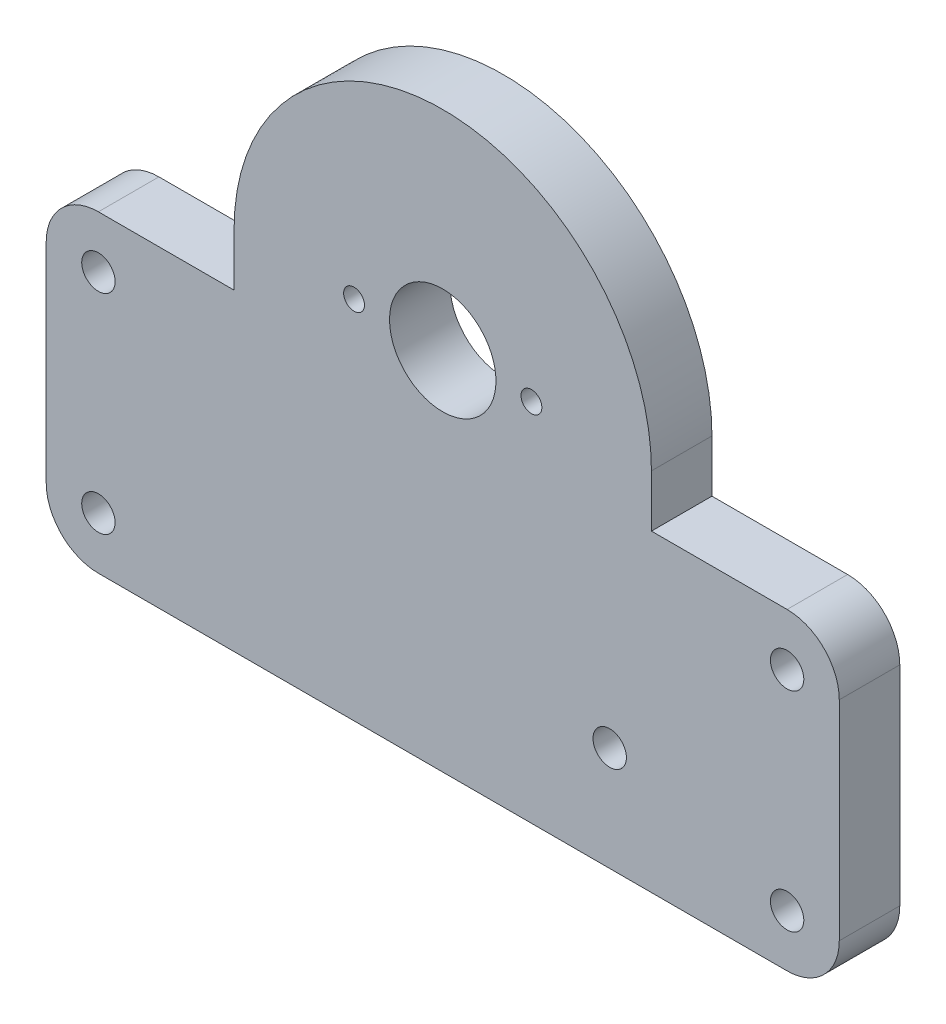
ISO-10303-21;
HEADER;
FILE_DESCRIPTION(('STEP AP214'),'2;1');
FILE_NAME('part.step','',(''),(''),'','','');
FILE_SCHEMA(('AUTOMOTIVE_DESIGN { 1 0 10303 214 1 1 1 1 }'));
ENDSEC;
DATA;
#1=APPLICATION_CONTEXT('core data for automotive mechanical design processes');
#2=APPLICATION_PROTOCOL_DEFINITION('international standard','automotive_design',2000,#1);
#3=PRODUCT_CONTEXT('',#1,'mechanical');
#4=PRODUCT('Part','Part','',(#3));
#5=PRODUCT_RELATED_PRODUCT_CATEGORY('part','',(#4));
#6=PRODUCT_DEFINITION_FORMATION('','',#4);
#7=PRODUCT_DEFINITION_CONTEXT('part definition',#1,'design');
#8=PRODUCT_DEFINITION('design','',#6,#7);
#9=PRODUCT_DEFINITION_SHAPE('','',#8);
#10=(LENGTH_UNIT() NAMED_UNIT(*) SI_UNIT(.MILLI.,.METRE.));
#11=(NAMED_UNIT(*) PLANE_ANGLE_UNIT() SI_UNIT($,.RADIAN.));
#12=(NAMED_UNIT(*) SI_UNIT($,.STERADIAN.) SOLID_ANGLE_UNIT());
#13=UNCERTAINTY_MEASURE_WITH_UNIT(LENGTH_MEASURE(1.E-05),#10,'distance_accuracy_value','');
#14=(GEOMETRIC_REPRESENTATION_CONTEXT(3) GLOBAL_UNCERTAINTY_ASSIGNED_CONTEXT((#13)) GLOBAL_UNIT_ASSIGNED_CONTEXT((#10,
#11,#12)) REPRESENTATION_CONTEXT('',''));
#15=CARTESIAN_POINT('',(0.,0.,0.));
#16=DIRECTION('',(0.,0.,1.));
#17=DIRECTION('',(1.,0.,0.));
#18=AXIS2_PLACEMENT_3D('',#15,#16,#17);
#19=CARTESIAN_POINT('',(38.,-30.,5.8));
#20=DIRECTION('',(-1.,0.,0.));
#21=DIRECTION('',(0.,0.,1.));
#22=AXIS2_PLACEMENT_3D('',#19,#20,#21);
#23=PLANE('',#22);
#24=DIRECTION('',(0.,1.,0.));
#25=VECTOR('',#24,1.);
#26=CARTESIAN_POINT('',(38.,-30.,0.));
#27=LINE('',#26,#25);
#28=CARTESIAN_POINT('',(38.,-25.,0.));
#29=VERTEX_POINT('',#28);
#30=CARTESIAN_POINT('',(38.,-5.,0.));
#31=VERTEX_POINT('',#30);
#32=EDGE_CURVE('E202',#29,#31,#27,.T.);
#33=ORIENTED_EDGE('',*,*,#32,.T.);
#34=DIRECTION('',(0.,0.,-1.));
#35=VECTOR('',#34,1.);
#36=CARTESIAN_POINT('',(38.,-5.,5.8));
#37=LINE('',#36,#35);
#38=CARTESIAN_POINT('',(38.,-5.,5.8));
#39=VERTEX_POINT('',#38);
#40=EDGE_CURVE('E12',#31,#39,#37,.F.);
#41=ORIENTED_EDGE('',*,*,#40,.T.);
#42=DIRECTION('',(0.,1.,0.));
#43=VECTOR('',#42,1.);
#44=CARTESIAN_POINT('',(38.,-30.,5.8));
#45=LINE('',#44,#43);
#46=CARTESIAN_POINT('',(38.,-25.,5.8));
#47=VERTEX_POINT('',#46);
#48=EDGE_CURVE('E183',#47,#39,#45,.T.);
#49=ORIENTED_EDGE('',*,*,#48,.F.);
#50=DIRECTION('',(0.,0.,-1.));
#51=VECTOR('',#50,1.);
#52=CARTESIAN_POINT('',(38.,-25.,5.8));
#53=LINE('',#52,#51);
#54=EDGE_CURVE('E225',#47,#29,#53,.T.);
#55=ORIENTED_EDGE('',*,*,#54,.T.);
#56=EDGE_LOOP('',(#33,#41,#49,#55));
#57=FACE_BOUND('',#56,.T.);
#58=ADVANCED_FACE('F37',(#57),#23,.F.);
#59=CARTESIAN_POINT('',(-38.,-30.,5.8));
#60=DIRECTION('',(1.,0.,0.));
#61=DIRECTION('',(0.,0.,-1.));
#62=AXIS2_PLACEMENT_3D('',#59,#60,#61);
#63=PLANE('',#62);
#64=DIRECTION('',(0.,-1.,0.));
#65=VECTOR('',#64,1.);
#66=CARTESIAN_POINT('',(-38.,-30.,5.8));
#67=LINE('',#66,#65);
#68=CARTESIAN_POINT('',(-38.,-5.,5.8));
#69=VERTEX_POINT('',#68);
#70=CARTESIAN_POINT('',(-38.,-25.,5.8));
#71=VERTEX_POINT('',#70);
#72=EDGE_CURVE('E187',#69,#71,#67,.T.);
#73=ORIENTED_EDGE('',*,*,#72,.F.);
#74=DIRECTION('',(0.,0.,-1.));
#75=VECTOR('',#74,1.);
#76=CARTESIAN_POINT('',(-38.,-5.,5.8));
#77=LINE('',#76,#75);
#78=CARTESIAN_POINT('',(-38.,-5.,0.));
#79=VERTEX_POINT('',#78);
#80=EDGE_CURVE('E228',#69,#79,#77,.T.);
#81=ORIENTED_EDGE('',*,*,#80,.T.);
#82=DIRECTION('',(0.,-1.,0.));
#83=VECTOR('',#82,1.);
#84=CARTESIAN_POINT('',(-38.,-30.,0.));
#85=LINE('',#84,#83);
#86=CARTESIAN_POINT('',(-38.,-25.,0.));
#87=VERTEX_POINT('',#86);
#88=EDGE_CURVE('E205',#79,#87,#85,.T.);
#89=ORIENTED_EDGE('',*,*,#88,.T.);
#90=DIRECTION('',(0.,0.,-1.));
#91=VECTOR('',#90,1.);
#92=CARTESIAN_POINT('',(-38.,-25.,5.8));
#93=LINE('',#92,#91);
#94=EDGE_CURVE('E201',#87,#71,#93,.F.);
#95=ORIENTED_EDGE('',*,*,#94,.T.);
#96=EDGE_LOOP('',(#73,#81,#89,#95));
#97=FACE_BOUND('',#96,.T.);
#98=ADVANCED_FACE('F249',(#97),#63,.F.);
#99=CARTESIAN_POINT('',(-38.,-30.,5.8));
#100=DIRECTION('',(0.,1.,0.));
#101=DIRECTION('',(0.,0.,1.));
#102=AXIS2_PLACEMENT_3D('',#99,#100,#101);
#103=PLANE('',#102);
#104=DIRECTION('',(1.,0.,0.));
#105=VECTOR('',#104,1.);
#106=CARTESIAN_POINT('',(-38.,-30.,5.8));
#107=LINE('',#106,#105);
#108=CARTESIAN_POINT('',(-33.,-30.,5.8));
#109=VERTEX_POINT('',#108);
#110=CARTESIAN_POINT('',(33.,-30.,5.8));
#111=VERTEX_POINT('',#110);
#112=EDGE_CURVE('E197',#109,#111,#107,.T.);
#113=ORIENTED_EDGE('',*,*,#112,.F.);
#114=DIRECTION('',(0.,0.,-1.));
#115=VECTOR('',#114,1.);
#116=CARTESIAN_POINT('',(-33.,-30.,5.8));
#117=LINE('',#116,#115);
#118=CARTESIAN_POINT('',(-33.,-30.,0.));
#119=VERTEX_POINT('',#118);
#120=EDGE_CURVE('E222',#109,#119,#117,.T.);
#121=ORIENTED_EDGE('',*,*,#120,.T.);
#122=DIRECTION('',(1.,0.,0.));
#123=VECTOR('',#122,1.);
#124=CARTESIAN_POINT('',(-38.,-30.,0.));
#125=LINE('',#124,#123);
#126=CARTESIAN_POINT('',(33.,-30.,0.));
#127=VERTEX_POINT('',#126);
#128=EDGE_CURVE('E188',#119,#127,#125,.T.);
#129=ORIENTED_EDGE('',*,*,#128,.T.);
#130=DIRECTION('',(0.,0.,-1.));
#131=VECTOR('',#130,1.);
#132=CARTESIAN_POINT('',(33.,-30.,5.8));
#133=LINE('',#132,#131);
#134=EDGE_CURVE('E220',#127,#111,#133,.F.);
#135=ORIENTED_EDGE('',*,*,#134,.T.);
#136=EDGE_LOOP('',(#113,#121,#129,#135));
#137=FACE_BOUND('',#136,.T.);
#138=ADVANCED_FACE('F360',(#137),#103,.F.);
#139=CARTESIAN_POINT('',(0.,0.,5.8));
#140=DIRECTION('',(0.,0.,-1.));
#141=DIRECTION('',(-1.,0.,0.));
#142=AXIS2_PLACEMENT_3D('',#139,#140,#141);
#143=PLANE('',#142);
#144=CARTESIAN_POINT('',(16.,-20.,5.8));
#145=DIRECTION('',(0.,0.,1.));
#146=DIRECTION('',(1.,0.,0.));
#147=AXIS2_PLACEMENT_3D('',#144,#145,#146);
#148=CIRCLE('',#147,1.6);
#149=CARTESIAN_POINT('',(17.6,-20.,5.8));
#150=VERTEX_POINT('',#149);
#151=EDGE_CURVE('E276',#150,#150,#148,.T.);
#152=ORIENTED_EDGE('',*,*,#151,.F.);
#153=EDGE_LOOP('',(#152));
#154=FACE_BOUND('',#153,.T.);
#155=CARTESIAN_POINT('',(8.5,5.,5.8));
#156=DIRECTION('',(0.,0.,-1.));
#157=DIRECTION('',(-1.,0.,0.));
#158=AXIS2_PLACEMENT_3D('',#155,#156,#157);
#159=CIRCLE('',#158,1.);
#160=CARTESIAN_POINT('',(7.5,5.,5.8));
#161=VERTEX_POINT('',#160);
#162=EDGE_CURVE('E135',#161,#161,#159,.T.);
#163=ORIENTED_EDGE('',*,*,#162,.T.);
#164=EDGE_LOOP('',(#163));
#165=FACE_BOUND('',#164,.T.);
#166=CARTESIAN_POINT('',(-8.5,5.,5.8));
#167=DIRECTION('',(0.,0.,-1.));
#168=DIRECTION('',(1.,0.,0.));
#169=AXIS2_PLACEMENT_3D('',#166,#167,#168);
#170=CIRCLE('',#169,1.);
#171=CARTESIAN_POINT('',(-7.5,5.,5.8));
#172=VERTEX_POINT('',#171);
#173=EDGE_CURVE('E290',#172,#172,#170,.T.);
#174=ORIENTED_EDGE('',*,*,#173,.T.);
#175=EDGE_LOOP('',(#174));
#176=FACE_BOUND('',#175,.T.);
#177=CARTESIAN_POINT('',(0.,5.,5.8));
#178=DIRECTION('',(0.,0.,-1.));
#179=DIRECTION('',(-1.,0.,0.));
#180=AXIS2_PLACEMENT_3D('',#177,#178,#179);
#181=CIRCLE('',#180,5.1);
#182=CARTESIAN_POINT('',(-5.1,5.,5.8));
#183=VERTEX_POINT('',#182);
#184=EDGE_CURVE('E189',#183,#183,#181,.T.);
#185=ORIENTED_EDGE('',*,*,#184,.T.);
#186=EDGE_LOOP('',(#185));
#187=FACE_BOUND('',#186,.T.);
#188=CARTESIAN_POINT('',(33.,-5.,5.8));
#189=DIRECTION('',(0.,0.,-1.));
#190=DIRECTION('',(-1.,0.,0.));
#191=AXIS2_PLACEMENT_3D('',#188,#189,#190);
#192=CIRCLE('',#191,1.6);
#193=CARTESIAN_POINT('',(31.4,-5.,5.8));
#194=VERTEX_POINT('',#193);
#195=EDGE_CURVE('E301',#194,#194,#192,.T.);
#196=ORIENTED_EDGE('',*,*,#195,.T.);
#197=EDGE_LOOP('',(#196));
#198=FACE_BOUND('',#197,.T.);
#199=CARTESIAN_POINT('',(33.,-25.,5.8));
#200=DIRECTION('',(0.,0.,-1.));
#201=DIRECTION('',(-1.,0.,0.));
#202=AXIS2_PLACEMENT_3D('',#199,#200,#201);
#203=CIRCLE('',#202,1.6);
#204=CARTESIAN_POINT('',(31.4,-25.,5.8));
#205=VERTEX_POINT('',#204);
#206=EDGE_CURVE('E304',#205,#205,#203,.T.);
#207=ORIENTED_EDGE('',*,*,#206,.T.);
#208=EDGE_LOOP('',(#207));
#209=FACE_BOUND('',#208,.T.);
#210=CARTESIAN_POINT('',(-33.,-25.,5.8));
#211=DIRECTION('',(0.,0.,-1.));
#212=DIRECTION('',(-1.,0.,0.));
#213=AXIS2_PLACEMENT_3D('',#210,#211,#212);
#214=CIRCLE('',#213,1.6);
#215=CARTESIAN_POINT('',(-34.6,-25.,5.8));
#216=VERTEX_POINT('',#215);
#217=EDGE_CURVE('E312',#216,#216,#214,.T.);
#218=ORIENTED_EDGE('',*,*,#217,.T.);
#219=EDGE_LOOP('',(#218));
#220=FACE_BOUND('',#219,.T.);
#221=CARTESIAN_POINT('',(-33.,-5.,5.8));
#222=DIRECTION('',(0.,0.,-1.));
#223=DIRECTION('',(-1.,0.,0.));
#224=AXIS2_PLACEMENT_3D('',#221,#222,#223);
#225=CIRCLE('',#224,1.6);
#226=CARTESIAN_POINT('',(-34.6,-5.,5.8));
#227=VERTEX_POINT('',#226);
#228=EDGE_CURVE('E315',#227,#227,#225,.T.);
#229=ORIENTED_EDGE('',*,*,#228,.T.);
#230=EDGE_LOOP('',(#229));
#231=FACE_BOUND('',#230,.T.);
#232=DIRECTION('',(-1.,0.,0.));
#233=VECTOR('',#232,1.);
#234=CARTESIAN_POINT('',(0.,0.,5.8));
#235=LINE('',#234,#233);
#236=CARTESIAN_POINT('',(-20.,0.,5.8));
#237=VERTEX_POINT('',#236);
#238=CARTESIAN_POINT('',(-33.,0.,5.8));
#239=VERTEX_POINT('',#238);
#240=EDGE_CURVE('E244',#237,#239,#235,.T.);
#241=ORIENTED_EDGE('',*,*,#240,.T.);
#242=CARTESIAN_POINT('',(-33.,-5.,5.8));
#243=DIRECTION('',(0.,0.,-1.));
#244=DIRECTION('',(-1.,0.,0.));
#245=AXIS2_PLACEMENT_3D('',#242,#243,#244);
#246=CIRCLE('',#245,5.);
#247=EDGE_CURVE('E238',#239,#69,#246,.F.);
#248=ORIENTED_EDGE('',*,*,#247,.T.);
#249=ORIENTED_EDGE('',*,*,#72,.T.);
#250=CARTESIAN_POINT('',(-33.,-25.,5.8));
#251=DIRECTION('',(0.,0.,-1.));
#252=DIRECTION('',(-1.,0.,0.));
#253=AXIS2_PLACEMENT_3D('',#250,#251,#252);
#254=CIRCLE('',#253,5.);
#255=EDGE_CURVE('E218',#71,#109,#254,.F.);
#256=ORIENTED_EDGE('',*,*,#255,.T.);
#257=ORIENTED_EDGE('',*,*,#112,.T.);
#258=CARTESIAN_POINT('',(33.,-25.,5.8));
#259=DIRECTION('',(0.,0.,-1.));
#260=DIRECTION('',(-1.,0.,0.));
#261=AXIS2_PLACEMENT_3D('',#258,#259,#260);
#262=CIRCLE('',#261,5.);
#263=EDGE_CURVE('E216',#111,#47,#262,.F.);
#264=ORIENTED_EDGE('',*,*,#263,.T.);
#265=ORIENTED_EDGE('',*,*,#48,.T.);
#266=CARTESIAN_POINT('',(33.,-5.,5.8));
#267=DIRECTION('',(0.,0.,-1.));
#268=DIRECTION('',(-1.,0.,0.));
#269=AXIS2_PLACEMENT_3D('',#266,#267,#268);
#270=CIRCLE('',#269,5.);
#271=CARTESIAN_POINT('',(33.,0.,5.8));
#272=VERTEX_POINT('',#271);
#273=EDGE_CURVE('E52',#39,#272,#270,.F.);
#274=ORIENTED_EDGE('',*,*,#273,.T.);
#275=DIRECTION('',(-1.,0.,0.));
#276=VECTOR('',#275,1.);
#277=CARTESIAN_POINT('',(0.,0.,5.8));
#278=LINE('',#277,#276);
#279=CARTESIAN_POINT('',(20.,0.,5.8));
#280=VERTEX_POINT('',#279);
#281=EDGE_CURVE('E165',#272,#280,#278,.T.);
#282=ORIENTED_EDGE('',*,*,#281,.T.);
#283=DIRECTION('',(0.,1.,0.));
#284=VECTOR('',#283,1.);
#285=CARTESIAN_POINT('',(20.,0.,5.8));
#286=LINE('',#285,#284);
#287=CARTESIAN_POINT('',(20.,5.,5.8));
#288=VERTEX_POINT('',#287);
#289=EDGE_CURVE('E144',#280,#288,#286,.T.);
#290=ORIENTED_EDGE('',*,*,#289,.T.);
#291=CARTESIAN_POINT('',(0.,5.,5.8));
#292=DIRECTION('',(0.,0.,-1.));
#293=DIRECTION('',(-1.,0.,0.));
#294=AXIS2_PLACEMENT_3D('',#291,#292,#293);
#295=CIRCLE('',#294,20.);
#296=CARTESIAN_POINT('',(-20.,5.,5.8));
#297=VERTEX_POINT('',#296);
#298=EDGE_CURVE('E264',#288,#297,#295,.F.);
#299=ORIENTED_EDGE('',*,*,#298,.T.);
#300=DIRECTION('',(0.,-1.,0.));
#301=VECTOR('',#300,1.);
#302=CARTESIAN_POINT('',(-20.,0.,5.8));
#303=LINE('',#302,#301);
#304=EDGE_CURVE('E260',#297,#237,#303,.T.);
#305=ORIENTED_EDGE('',*,*,#304,.T.);
#306=EDGE_LOOP('',(#241,#248,#249,#256,#257,#264,#265,#274,#282,#290,#299,#305));
#307=FACE_BOUND('',#306,.T.);
#308=ADVANCED_FACE('F242',(#154,#165,#176,#187,#198,#209,#220,#231,#307),#143,.F.);
#309=CARTESIAN_POINT('',(0.,0.,0.));
#310=DIRECTION('',(0.,0.,-1.));
#311=DIRECTION('',(-1.,0.,0.));
#312=AXIS2_PLACEMENT_3D('',#309,#310,#311);
#313=PLANE('',#312);
#314=CARTESIAN_POINT('',(16.,-20.,0.));
#315=DIRECTION('',(0.,0.,1.));
#316=DIRECTION('',(1.,0.,0.));
#317=AXIS2_PLACEMENT_3D('',#314,#315,#316);
#318=CIRCLE('',#317,1.6);
#319=CARTESIAN_POINT('',(17.6,-20.,0.));
#320=VERTEX_POINT('',#319);
#321=EDGE_CURVE('E280',#320,#320,#318,.T.);
#322=ORIENTED_EDGE('',*,*,#321,.T.);
#323=EDGE_LOOP('',(#322));
#324=FACE_BOUND('',#323,.T.);
#325=CARTESIAN_POINT('',(8.5,5.,0.));
#326=DIRECTION('',(0.,0.,-1.));
#327=DIRECTION('',(-1.,0.,0.));
#328=AXIS2_PLACEMENT_3D('',#325,#326,#327);
#329=CIRCLE('',#328,1.);
#330=CARTESIAN_POINT('',(7.5,5.,0.));
#331=VERTEX_POINT('',#330);
#332=EDGE_CURVE('E293',#331,#331,#329,.T.);
#333=ORIENTED_EDGE('',*,*,#332,.F.);
#334=EDGE_LOOP('',(#333));
#335=FACE_BOUND('',#334,.T.);
#336=CARTESIAN_POINT('',(-8.5,5.,0.));
#337=DIRECTION('',(0.,0.,-1.));
#338=DIRECTION('',(1.,0.,0.));
#339=AXIS2_PLACEMENT_3D('',#336,#337,#338);
#340=CIRCLE('',#339,1.);
#341=CARTESIAN_POINT('',(-7.5,5.,0.));
#342=VERTEX_POINT('',#341);
#343=EDGE_CURVE('E294',#342,#342,#340,.T.);
#344=ORIENTED_EDGE('',*,*,#343,.F.);
#345=EDGE_LOOP('',(#344));
#346=FACE_BOUND('',#345,.T.);
#347=ORIENTED_EDGE('',*,*,#88,.F.);
#348=CARTESIAN_POINT('',(-33.,-5.,0.));
#349=DIRECTION('',(0.,0.,-1.));
#350=DIRECTION('',(-1.,0.,0.));
#351=AXIS2_PLACEMENT_3D('',#348,#349,#350);
#352=CIRCLE('',#351,5.);
#353=CARTESIAN_POINT('',(-33.,0.,0.));
#354=VERTEX_POINT('',#353);
#355=EDGE_CURVE('E233',#79,#354,#352,.T.);
#356=ORIENTED_EDGE('',*,*,#355,.T.);
#357=DIRECTION('',(-1.,0.,0.));
#358=VECTOR('',#357,1.);
#359=CARTESIAN_POINT('',(-20.,0.,0.));
#360=LINE('',#359,#358);
#361=CARTESIAN_POINT('',(-20.,0.,0.));
#362=VERTEX_POINT('',#361);
#363=EDGE_CURVE('E146',#362,#354,#360,.T.);
#364=ORIENTED_EDGE('',*,*,#363,.F.);
#365=DIRECTION('',(0.,-1.,0.));
#366=VECTOR('',#365,1.);
#367=CARTESIAN_POINT('',(-20.,5.,0.));
#368=LINE('',#367,#366);
#369=CARTESIAN_POINT('',(-20.,5.,0.));
#370=VERTEX_POINT('',#369);
#371=EDGE_CURVE('E155',#370,#362,#368,.T.);
#372=ORIENTED_EDGE('',*,*,#371,.F.);
#373=CARTESIAN_POINT('',(0.,5.,0.));
#374=DIRECTION('',(0.,0.,1.));
#375=DIRECTION('',(1.,0.,0.));
#376=AXIS2_PLACEMENT_3D('',#373,#374,#375);
#377=CIRCLE('',#376,20.);
#378=CARTESIAN_POINT('',(20.,5.,0.));
#379=VERTEX_POINT('',#378);
#380=EDGE_CURVE('E153',#379,#370,#377,.T.);
#381=ORIENTED_EDGE('',*,*,#380,.F.);
#382=DIRECTION('',(0.,1.,0.));
#383=VECTOR('',#382,1.);
#384=CARTESIAN_POINT('',(20.,0.,0.));
#385=LINE('',#384,#383);
#386=CARTESIAN_POINT('',(20.,0.,0.));
#387=VERTEX_POINT('',#386);
#388=EDGE_CURVE('E134',#387,#379,#385,.T.);
#389=ORIENTED_EDGE('',*,*,#388,.F.);
#390=DIRECTION('',(-1.,0.,0.));
#391=VECTOR('',#390,1.);
#392=CARTESIAN_POINT('',(38.,0.,0.));
#393=LINE('',#392,#391);
#394=CARTESIAN_POINT('',(33.,0.,0.));
#395=VERTEX_POINT('',#394);
#396=EDGE_CURVE('E127',#395,#387,#393,.T.);
#397=ORIENTED_EDGE('',*,*,#396,.F.);
#398=CARTESIAN_POINT('',(33.,-5.,0.));
#399=DIRECTION('',(0.,0.,-1.));
#400=DIRECTION('',(-1.,0.,0.));
#401=AXIS2_PLACEMENT_3D('',#398,#399,#400);
#402=CIRCLE('',#401,5.);
#403=EDGE_CURVE('E231',#395,#31,#402,.T.);
#404=ORIENTED_EDGE('',*,*,#403,.T.);
#405=ORIENTED_EDGE('',*,*,#32,.F.);
#406=CARTESIAN_POINT('',(33.,-25.,0.));
#407=DIRECTION('',(0.,0.,-1.));
#408=DIRECTION('',(-1.,0.,0.));
#409=AXIS2_PLACEMENT_3D('',#406,#407,#408);
#410=CIRCLE('',#409,5.);
#411=EDGE_CURVE('E211',#29,#127,#410,.T.);
#412=ORIENTED_EDGE('',*,*,#411,.T.);
#413=ORIENTED_EDGE('',*,*,#128,.F.);
#414=CARTESIAN_POINT('',(-33.,-25.,0.));
#415=DIRECTION('',(0.,0.,-1.));
#416=DIRECTION('',(-1.,0.,0.));
#417=AXIS2_PLACEMENT_3D('',#414,#415,#416);
#418=CIRCLE('',#417,5.);
#419=EDGE_CURVE('E213',#119,#87,#418,.T.);
#420=ORIENTED_EDGE('',*,*,#419,.T.);
#421=EDGE_LOOP('',(#347,#356,#364,#372,#381,#389,#397,#404,#405,#412,#413,#420));
#422=FACE_BOUND('',#421,.T.);
#423=CARTESIAN_POINT('',(0.,5.,0.));
#424=DIRECTION('',(0.,0.,-1.));
#425=DIRECTION('',(-1.,0.,0.));
#426=AXIS2_PLACEMENT_3D('',#423,#424,#425);
#427=CIRCLE('',#426,5.1);
#428=CARTESIAN_POINT('',(-5.1,5.,0.));
#429=VERTEX_POINT('',#428);
#430=EDGE_CURVE('E322',#429,#429,#427,.T.);
#431=ORIENTED_EDGE('',*,*,#430,.F.);
#432=EDGE_LOOP('',(#431));
#433=FACE_BOUND('',#432,.T.);
#434=CARTESIAN_POINT('',(33.,-5.,0.));
#435=DIRECTION('',(0.,0.,-1.));
#436=DIRECTION('',(-1.,0.,0.));
#437=AXIS2_PLACEMENT_3D('',#434,#435,#436);
#438=CIRCLE('',#437,1.6);
#439=CARTESIAN_POINT('',(31.4,-5.,0.));
#440=VERTEX_POINT('',#439);
#441=EDGE_CURVE('E333',#440,#440,#438,.T.);
#442=ORIENTED_EDGE('',*,*,#441,.F.);
#443=EDGE_LOOP('',(#442));
#444=FACE_BOUND('',#443,.T.);
#445=CARTESIAN_POINT('',(33.,-25.,0.));
#446=DIRECTION('',(0.,0.,-1.));
#447=DIRECTION('',(-1.,0.,0.));
#448=AXIS2_PLACEMENT_3D('',#445,#446,#447);
#449=CIRCLE('',#448,1.6);
#450=CARTESIAN_POINT('',(31.4,-25.,0.));
#451=VERTEX_POINT('',#450);
#452=EDGE_CURVE('E330',#451,#451,#449,.T.);
#453=ORIENTED_EDGE('',*,*,#452,.F.);
#454=EDGE_LOOP('',(#453));
#455=FACE_BOUND('',#454,.T.);
#456=CARTESIAN_POINT('',(-33.,-25.,0.));
#457=DIRECTION('',(0.,0.,-1.));
#458=DIRECTION('',(1.,0.,0.));
#459=AXIS2_PLACEMENT_3D('',#456,#457,#458);
#460=CIRCLE('',#459,1.6);
#461=CARTESIAN_POINT('',(-31.4,-25.,0.));
#462=VERTEX_POINT('',#461);
#463=EDGE_CURVE('E327',#462,#462,#460,.T.);
#464=ORIENTED_EDGE('',*,*,#463,.F.);
#465=EDGE_LOOP('',(#464));
#466=FACE_BOUND('',#465,.T.);
#467=CARTESIAN_POINT('',(-33.,-5.,0.));
#468=DIRECTION('',(0.,0.,-1.));
#469=DIRECTION('',(1.,0.,0.));
#470=AXIS2_PLACEMENT_3D('',#467,#468,#469);
#471=CIRCLE('',#470,1.6);
#472=CARTESIAN_POINT('',(-31.4,-5.,0.));
#473=VERTEX_POINT('',#472);
#474=EDGE_CURVE('E323',#473,#473,#471,.T.);
#475=ORIENTED_EDGE('',*,*,#474,.F.);
#476=EDGE_LOOP('',(#475));
#477=FACE_BOUND('',#476,.T.);
#478=ADVANCED_FACE('F149',(#324,#335,#346,#422,#433,#444,#455,#466,#477),#313,.T.);
#479=CARTESIAN_POINT('',(-33.,-5.,50.));
#480=DIRECTION('',(0.,0.,-1.));
#481=DIRECTION('',(-1.,0.,0.));
#482=AXIS2_PLACEMENT_3D('',#479,#480,#481);
#483=CYLINDRICAL_SURFACE('',#482,1.6);
#484=ORIENTED_EDGE('',*,*,#474,.T.);
#485=EDGE_LOOP('',(#484));
#486=FACE_BOUND('',#485,.T.);
#487=ORIENTED_EDGE('',*,*,#228,.F.);
#488=EDGE_LOOP('',(#487));
#489=FACE_BOUND('',#488,.T.);
#490=ADVANCED_FACE('F342',(#486,#489),#483,.F.);
#491=CARTESIAN_POINT('',(-33.,-25.,50.));
#492=DIRECTION('',(0.,0.,-1.));
#493=DIRECTION('',(-1.,0.,0.));
#494=AXIS2_PLACEMENT_3D('',#491,#492,#493);
#495=CYLINDRICAL_SURFACE('',#494,1.6);
#496=ORIENTED_EDGE('',*,*,#463,.T.);
#497=EDGE_LOOP('',(#496));
#498=FACE_BOUND('',#497,.T.);
#499=ORIENTED_EDGE('',*,*,#217,.F.);
#500=EDGE_LOOP('',(#499));
#501=FACE_BOUND('',#500,.T.);
#502=ADVANCED_FACE('F355',(#498,#501),#495,.F.);
#503=CARTESIAN_POINT('',(33.,-25.,50.));
#504=DIRECTION('',(0.,0.,-1.));
#505=DIRECTION('',(-1.,0.,0.));
#506=AXIS2_PLACEMENT_3D('',#503,#504,#505);
#507=CYLINDRICAL_SURFACE('',#506,1.6);
#508=ORIENTED_EDGE('',*,*,#452,.T.);
#509=EDGE_LOOP('',(#508));
#510=FACE_BOUND('',#509,.T.);
#511=ORIENTED_EDGE('',*,*,#206,.F.);
#512=EDGE_LOOP('',(#511));
#513=FACE_BOUND('',#512,.T.);
#514=ADVANCED_FACE('F403',(#510,#513),#507,.F.);
#515=CARTESIAN_POINT('',(33.,-5.,50.));
#516=DIRECTION('',(0.,0.,-1.));
#517=DIRECTION('',(-1.,0.,0.));
#518=AXIS2_PLACEMENT_3D('',#515,#516,#517);
#519=CYLINDRICAL_SURFACE('',#518,1.6);
#520=ORIENTED_EDGE('',*,*,#441,.T.);
#521=EDGE_LOOP('',(#520));
#522=FACE_BOUND('',#521,.T.);
#523=ORIENTED_EDGE('',*,*,#195,.F.);
#524=EDGE_LOOP('',(#523));
#525=FACE_BOUND('',#524,.T.);
#526=ADVANCED_FACE('F400',(#522,#525),#519,.F.);
#527=CARTESIAN_POINT('',(0.,5.,50.));
#528=DIRECTION('',(0.,0.,-1.));
#529=DIRECTION('',(-1.,0.,0.));
#530=AXIS2_PLACEMENT_3D('',#527,#528,#529);
#531=CYLINDRICAL_SURFACE('',#530,5.1);
#532=ORIENTED_EDGE('',*,*,#430,.T.);
#533=EDGE_LOOP('',(#532));
#534=FACE_BOUND('',#533,.T.);
#535=ORIENTED_EDGE('',*,*,#184,.F.);
#536=EDGE_LOOP('',(#535));
#537=FACE_BOUND('',#536,.T.);
#538=ADVANCED_FACE('F338',(#534,#537),#531,.F.);
#539=CARTESIAN_POINT('',(-33.,-25.,5.8));
#540=DIRECTION('',(0.,0.,-1.));
#541=DIRECTION('',(-1.,0.,0.));
#542=AXIS2_PLACEMENT_3D('',#539,#540,#541);
#543=CYLINDRICAL_SURFACE('',#542,5.);
#544=ORIENTED_EDGE('',*,*,#255,.F.);
#545=ORIENTED_EDGE('',*,*,#94,.F.);
#546=ORIENTED_EDGE('',*,*,#419,.F.);
#547=ORIENTED_EDGE('',*,*,#120,.F.);
#548=EDGE_LOOP('',(#544,#545,#546,#547));
#549=FACE_BOUND('',#548,.T.);
#550=ADVANCED_FACE('F377',(#549),#543,.T.);
#551=CARTESIAN_POINT('',(33.,-25.,5.8));
#552=DIRECTION('',(0.,0.,-1.));
#553=DIRECTION('',(-1.,0.,0.));
#554=AXIS2_PLACEMENT_3D('',#551,#552,#553);
#555=CYLINDRICAL_SURFACE('',#554,5.);
#556=ORIENTED_EDGE('',*,*,#263,.F.);
#557=ORIENTED_EDGE('',*,*,#134,.F.);
#558=ORIENTED_EDGE('',*,*,#411,.F.);
#559=ORIENTED_EDGE('',*,*,#54,.F.);
#560=EDGE_LOOP('',(#556,#557,#558,#559));
#561=FACE_BOUND('',#560,.T.);
#562=ADVANCED_FACE('F380',(#561),#555,.T.);
#563=CARTESIAN_POINT('',(-20.,0.,13.5));
#564=DIRECTION('',(0.,-1.,0.));
#565=DIRECTION('',(0.,0.,-1.));
#566=AXIS2_PLACEMENT_3D('',#563,#564,#565);
#567=PLANE('',#566);
#568=ORIENTED_EDGE('',*,*,#363,.T.);
#569=DIRECTION('',(0.,0.,-1.));
#570=VECTOR('',#569,1.);
#571=CARTESIAN_POINT('',(-33.,0.,13.5));
#572=LINE('',#571,#570);
#573=EDGE_CURVE('E235',#354,#239,#572,.F.);
#574=ORIENTED_EDGE('',*,*,#573,.T.);
#575=ORIENTED_EDGE('',*,*,#240,.F.);
#576=DIRECTION('',(0.,0.,-1.));
#577=VECTOR('',#576,1.);
#578=CARTESIAN_POINT('',(-20.,0.,13.5));
#579=LINE('',#578,#577);
#580=EDGE_CURVE('E163',#237,#362,#579,.T.);
#581=ORIENTED_EDGE('',*,*,#580,.T.);
#582=EDGE_LOOP('',(#568,#574,#575,#581));
#583=FACE_BOUND('',#582,.T.);
#584=ADVANCED_FACE('F255',(#583),#567,.F.);
#585=CARTESIAN_POINT('',(-20.,5.,13.5));
#586=DIRECTION('',(1.,0.,0.));
#587=DIRECTION('',(0.,0.,-1.));
#588=AXIS2_PLACEMENT_3D('',#585,#586,#587);
#589=PLANE('',#588);
#590=DIRECTION('',(0.,0.,-1.));
#591=VECTOR('',#590,1.);
#592=CARTESIAN_POINT('',(-20.,5.,13.5));
#593=LINE('',#592,#591);
#594=EDGE_CURVE('E166',#297,#370,#593,.T.);
#595=ORIENTED_EDGE('',*,*,#594,.T.);
#596=ORIENTED_EDGE('',*,*,#371,.T.);
#597=ORIENTED_EDGE('',*,*,#580,.F.);
#598=ORIENTED_EDGE('',*,*,#304,.F.);
#599=EDGE_LOOP('',(#595,#596,#597,#598));
#600=FACE_BOUND('',#599,.T.);
#601=ADVANCED_FACE('F258',(#600),#589,.F.);
#602=CARTESIAN_POINT('',(0.,5.,13.5));
#603=DIRECTION('',(0.,0.,-1.));
#604=DIRECTION('',(-1.,0.,0.));
#605=AXIS2_PLACEMENT_3D('',#602,#603,#604);
#606=CYLINDRICAL_SURFACE('',#605,20.);
#607=DIRECTION('',(0.,0.,-1.));
#608=VECTOR('',#607,1.);
#609=CARTESIAN_POINT('',(20.,5.,13.5));
#610=LINE('',#609,#608);
#611=EDGE_CURVE('E145',#288,#379,#610,.T.);
#612=ORIENTED_EDGE('',*,*,#611,.T.);
#613=ORIENTED_EDGE('',*,*,#380,.T.);
#614=ORIENTED_EDGE('',*,*,#594,.F.);
#615=ORIENTED_EDGE('',*,*,#298,.F.);
#616=EDGE_LOOP('',(#612,#613,#614,#615));
#617=FACE_BOUND('',#616,.T.);
#618=ADVANCED_FACE('F263',(#617),#606,.T.);
#619=CARTESIAN_POINT('',(20.,0.,13.5));
#620=DIRECTION('',(-1.,0.,0.));
#621=DIRECTION('',(0.,0.,1.));
#622=AXIS2_PLACEMENT_3D('',#619,#620,#621);
#623=PLANE('',#622);
#624=DIRECTION('',(0.,0.,-1.));
#625=VECTOR('',#624,1.);
#626=CARTESIAN_POINT('',(20.,0.,13.5));
#627=LINE('',#626,#625);
#628=EDGE_CURVE('E130',#280,#387,#627,.T.);
#629=ORIENTED_EDGE('',*,*,#628,.T.);
#630=ORIENTED_EDGE('',*,*,#388,.T.);
#631=ORIENTED_EDGE('',*,*,#611,.F.);
#632=ORIENTED_EDGE('',*,*,#289,.F.);
#633=EDGE_LOOP('',(#629,#630,#631,#632));
#634=FACE_BOUND('',#633,.T.);
#635=ADVANCED_FACE('F140',(#634),#623,.F.);
#636=CARTESIAN_POINT('',(38.,0.,13.5));
#637=DIRECTION('',(0.,-1.,0.));
#638=DIRECTION('',(0.,0.,-1.));
#639=AXIS2_PLACEMENT_3D('',#636,#637,#638);
#640=PLANE('',#639);
#641=ORIENTED_EDGE('',*,*,#281,.F.);
#642=DIRECTION('',(0.,0.,-1.));
#643=VECTOR('',#642,1.);
#644=CARTESIAN_POINT('',(33.,0.,13.5));
#645=LINE('',#644,#643);
#646=EDGE_CURVE('E45',#272,#395,#645,.T.);
#647=ORIENTED_EDGE('',*,*,#646,.T.);
#648=ORIENTED_EDGE('',*,*,#396,.T.);
#649=ORIENTED_EDGE('',*,*,#628,.F.);
#650=EDGE_LOOP('',(#641,#647,#648,#649));
#651=FACE_BOUND('',#650,.T.);
#652=ADVANCED_FACE('F129',(#651),#640,.F.);
#653=CARTESIAN_POINT('',(-33.,-5.,5.8));
#654=DIRECTION('',(0.,0.,-1.));
#655=DIRECTION('',(-1.,0.,0.));
#656=AXIS2_PLACEMENT_3D('',#653,#654,#655);
#657=CYLINDRICAL_SURFACE('',#656,5.);
#658=ORIENTED_EDGE('',*,*,#247,.F.);
#659=ORIENTED_EDGE('',*,*,#573,.F.);
#660=ORIENTED_EDGE('',*,*,#355,.F.);
#661=ORIENTED_EDGE('',*,*,#80,.F.);
#662=EDGE_LOOP('',(#658,#659,#660,#661));
#663=FACE_BOUND('',#662,.T.);
#664=ADVANCED_FACE('F252',(#663),#657,.T.);
#665=CARTESIAN_POINT('',(33.,-5.,13.5));
#666=DIRECTION('',(0.,0.,-1.));
#667=DIRECTION('',(-1.,0.,0.));
#668=AXIS2_PLACEMENT_3D('',#665,#666,#667);
#669=CYLINDRICAL_SURFACE('',#668,5.);
#670=ORIENTED_EDGE('',*,*,#273,.F.);
#671=ORIENTED_EDGE('',*,*,#40,.F.);
#672=ORIENTED_EDGE('',*,*,#403,.F.);
#673=ORIENTED_EDGE('',*,*,#646,.F.);
#674=EDGE_LOOP('',(#670,#671,#672,#673));
#675=FACE_BOUND('',#674,.T.);
#676=ADVANCED_FACE('F39',(#675),#669,.T.);
#677=CARTESIAN_POINT('',(-8.5,5.,5.8));
#678=DIRECTION('',(0.,0.,-1.));
#679=DIRECTION('',(-1.,0.,0.));
#680=AXIS2_PLACEMENT_3D('',#677,#678,#679);
#681=CYLINDRICAL_SURFACE('',#680,1.);
#682=ORIENTED_EDGE('',*,*,#173,.F.);
#683=EDGE_LOOP('',(#682));
#684=FACE_BOUND('',#683,.T.);
#685=ORIENTED_EDGE('',*,*,#343,.T.);
#686=EDGE_LOOP('',(#685));
#687=FACE_BOUND('',#686,.T.);
#688=ADVANCED_FACE('F389',(#684,#687),#681,.F.);
#689=CARTESIAN_POINT('',(8.5,5.,5.8));
#690=DIRECTION('',(0.,0.,-1.));
#691=DIRECTION('',(-1.,0.,0.));
#692=AXIS2_PLACEMENT_3D('',#689,#690,#691);
#693=CYLINDRICAL_SURFACE('',#692,1.);
#694=ORIENTED_EDGE('',*,*,#162,.F.);
#695=EDGE_LOOP('',(#694));
#696=FACE_BOUND('',#695,.T.);
#697=ORIENTED_EDGE('',*,*,#332,.T.);
#698=EDGE_LOOP('',(#697));
#699=FACE_BOUND('',#698,.T.);
#700=ADVANCED_FACE('F517',(#696,#699),#693,.F.);
#701=CARTESIAN_POINT('',(16.,-20.,0.));
#702=DIRECTION('',(0.,0.,1.));
#703=DIRECTION('',(1.,0.,0.));
#704=AXIS2_PLACEMENT_3D('',#701,#702,#703);
#705=CYLINDRICAL_SURFACE('',#704,1.6);
#706=ORIENTED_EDGE('',*,*,#321,.F.);
#707=EDGE_LOOP('',(#706));
#708=FACE_BOUND('',#707,.T.);
#709=ORIENTED_EDGE('',*,*,#151,.T.);
#710=EDGE_LOOP('',(#709));
#711=FACE_BOUND('',#710,.T.);
#712=ADVANCED_FACE('F513',(#708,#711),#705,.F.);
#713=CLOSED_SHELL('',(#58,#98,#138,#308,#478,#490,#502,#514,#526,#538,#550,#562,#584,#601,#618,
#635,#652,#664,#676,#688,#700,#712));
#714=MANIFOLD_SOLID_BREP('B2',#713);
#715=ADVANCED_BREP_SHAPE_REPRESENTATION('',(#18,#714),#14);
#716=SHAPE_DEFINITION_REPRESENTATION(#9,#715);
ENDSEC;
END-ISO-10303-21;
